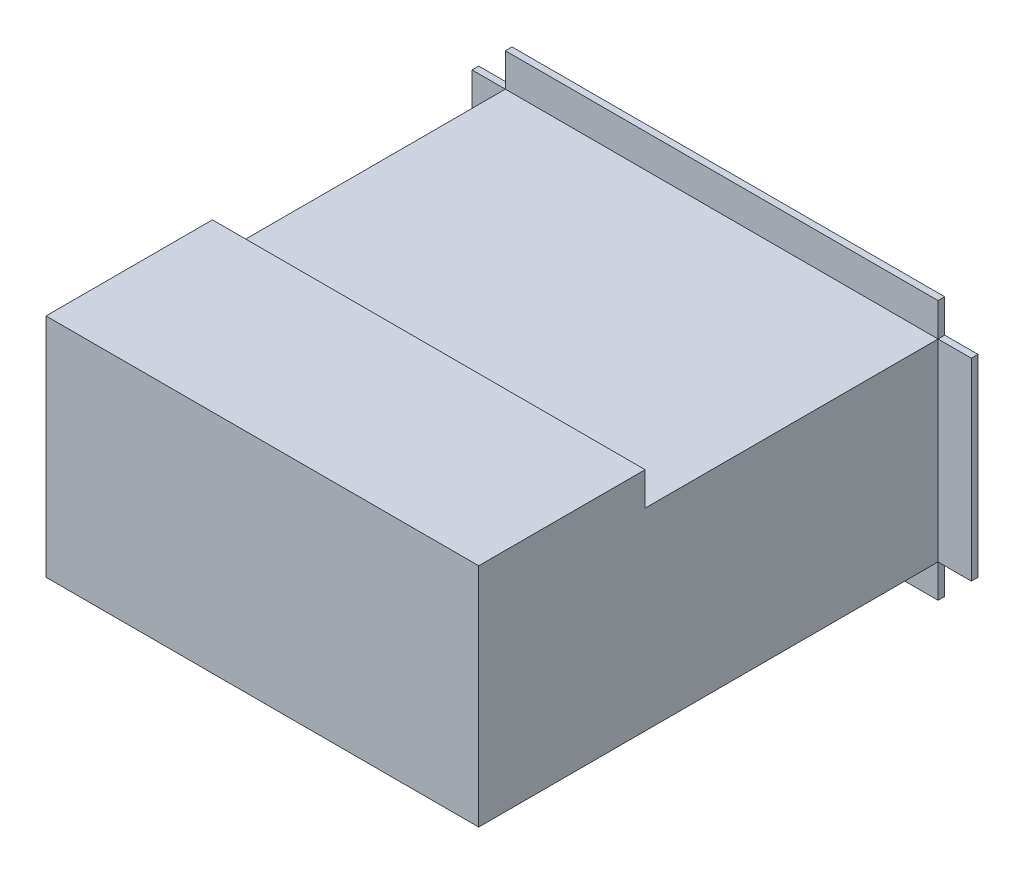
ISO-10303-21;
HEADER;
FILE_DESCRIPTION(('STEP AP214'),'2;1');
FILE_NAME('part.step','',(''),(''),'','','');
FILE_SCHEMA(('AUTOMOTIVE_DESIGN { 1 0 10303 214 1 1 1 1 }'));
ENDSEC;
DATA;
#1=APPLICATION_CONTEXT('core data for automotive mechanical design processes');
#2=APPLICATION_PROTOCOL_DEFINITION('international standard','automotive_design',2000,#1);
#3=PRODUCT_CONTEXT('',#1,'mechanical');
#4=PRODUCT('Part','Part','',(#3));
#5=PRODUCT_RELATED_PRODUCT_CATEGORY('part','',(#4));
#6=PRODUCT_DEFINITION_FORMATION('','',#4);
#7=PRODUCT_DEFINITION_CONTEXT('part definition',#1,'design');
#8=PRODUCT_DEFINITION('design','',#6,#7);
#9=PRODUCT_DEFINITION_SHAPE('','',#8);
#10=(LENGTH_UNIT() NAMED_UNIT(*) SI_UNIT(.MILLI.,.METRE.));
#11=(NAMED_UNIT(*) PLANE_ANGLE_UNIT() SI_UNIT($,.RADIAN.));
#12=(NAMED_UNIT(*) SI_UNIT($,.STERADIAN.) SOLID_ANGLE_UNIT());
#13=UNCERTAINTY_MEASURE_WITH_UNIT(LENGTH_MEASURE(1.E-05),#10,'distance_accuracy_value','');
#14=(GEOMETRIC_REPRESENTATION_CONTEXT(3) GLOBAL_UNCERTAINTY_ASSIGNED_CONTEXT((#13)) GLOBAL_UNIT_ASSIGNED_CONTEXT((#10,
#11,#12)) REPRESENTATION_CONTEXT('',''));
#15=CARTESIAN_POINT('',(0.,0.,0.));
#16=DIRECTION('',(0.,0.,1.));
#17=DIRECTION('',(1.,0.,0.));
#18=AXIS2_PLACEMENT_3D('',#15,#16,#17);
#19=CARTESIAN_POINT('',(-6.5,2.4,9.));
#20=DIRECTION('',(0.,0.,1.));
#21=DIRECTION('',(1.,0.,0.));
#22=AXIS2_PLACEMENT_3D('',#19,#20,#21);
#23=PLANE('',#22);
#24=DIRECTION('',(-1.,0.,0.));
#25=VECTOR('',#24,1.);
#26=CARTESIAN_POINT('',(6.3,-3.2,9.));
#27=LINE('',#26,#25);
#28=CARTESIAN_POINT('',(6.3,-3.2,9.));
#29=VERTEX_POINT('',#28);
#30=CARTESIAN_POINT('',(-6.3,-3.2,9.));
#31=VERTEX_POINT('',#30);
#32=EDGE_CURVE('E256',#29,#31,#27,.T.);
#33=ORIENTED_EDGE('',*,*,#32,.T.);
#34=DIRECTION('',(0.,1.,0.));
#35=VECTOR('',#34,1.);
#36=CARTESIAN_POINT('',(-6.3,-3.2,9.));
#37=LINE('',#36,#35);
#38=CARTESIAN_POINT('',(-6.3,2.2,9.));
#39=VERTEX_POINT('',#38);
#40=EDGE_CURVE('E244',#31,#39,#37,.T.);
#41=ORIENTED_EDGE('',*,*,#40,.T.);
#42=DIRECTION('',(1.,0.,0.));
#43=VECTOR('',#42,1.);
#44=CARTESIAN_POINT('',(-6.3,2.2,9.));
#45=LINE('',#44,#43);
#46=CARTESIAN_POINT('',(6.3,2.2,9.));
#47=VERTEX_POINT('',#46);
#48=EDGE_CURVE('E265',#39,#47,#45,.T.);
#49=ORIENTED_EDGE('',*,*,#48,.T.);
#50=DIRECTION('',(0.,-1.,0.));
#51=VECTOR('',#50,1.);
#52=CARTESIAN_POINT('',(6.3,2.2,9.));
#53=LINE('',#52,#51);
#54=EDGE_CURVE('E261',#47,#29,#53,.T.);
#55=ORIENTED_EDGE('',*,*,#54,.T.);
#56=EDGE_LOOP('',(#33,#41,#49,#55));
#57=FACE_BOUND('',#56,.T.);
#58=DIRECTION('',(1.,0.,0.));
#59=VECTOR('',#58,1.);
#60=CARTESIAN_POINT('',(5.,-0.199999999999997,9.));
#61=LINE('',#60,#59);
#62=CARTESIAN_POINT('',(-5.,-0.199999999999996,9.));
#63=VERTEX_POINT('',#62);
#64=CARTESIAN_POINT('',(5.,-0.199999999999997,9.));
#65=VERTEX_POINT('',#64);
#66=EDGE_CURVE('E236',#63,#65,#61,.T.);
#67=ORIENTED_EDGE('',*,*,#66,.F.);
#68=DIRECTION('',(0.,1.,0.));
#69=VECTOR('',#68,1.);
#70=CARTESIAN_POINT('',(-5.,-0.199999999999996,9.));
#71=LINE('',#70,#69);
#72=CARTESIAN_POINT('',(-5.,-2.19999999999999,9.));
#73=VERTEX_POINT('',#72);
#74=EDGE_CURVE('E223',#73,#63,#71,.T.);
#75=ORIENTED_EDGE('',*,*,#74,.F.);
#76=DIRECTION('',(-1.,0.,0.));
#77=VECTOR('',#76,1.);
#78=CARTESIAN_POINT('',(5.,-2.2,9.));
#79=LINE('',#78,#77);
#80=CARTESIAN_POINT('',(5.,-2.2,9.));
#81=VERTEX_POINT('',#80);
#82=EDGE_CURVE('E209',#81,#73,#79,.T.);
#83=ORIENTED_EDGE('',*,*,#82,.F.);
#84=DIRECTION('',(0.,-1.,0.));
#85=VECTOR('',#84,1.);
#86=CARTESIAN_POINT('',(5.,-0.199999999999997,9.));
#87=LINE('',#86,#85);
#88=EDGE_CURVE('E220',#65,#81,#87,.T.);
#89=ORIENTED_EDGE('',*,*,#88,.F.);
#90=EDGE_LOOP('',(#67,#75,#83,#89));
#91=FACE_BOUND('',#90,.T.);
#92=ADVANCED_FACE('F37',(#57,#91),#23,.F.);
#93=CARTESIAN_POINT('',(-6.5,3.4,14.));
#94=DIRECTION('',(1.,0.,0.));
#95=DIRECTION('',(0.,0.,-1.));
#96=AXIS2_PLACEMENT_3D('',#93,#94,#95);
#97=PLANE('',#96);
#98=DIRECTION('',(0.,1.,0.));
#99=VECTOR('',#98,1.);
#100=CARTESIAN_POINT('',(-6.5,3.4,0.200000000000001));
#101=LINE('',#100,#99);
#102=CARTESIAN_POINT('',(-6.5,-3.4,0.200000000000001));
#103=VERTEX_POINT('',#102);
#104=CARTESIAN_POINT('',(-6.5,2.4,0.200000000000001));
#105=VERTEX_POINT('',#104);
#106=EDGE_CURVE('E346',#103,#105,#101,.T.);
#107=ORIENTED_EDGE('',*,*,#106,.F.);
#108=DIRECTION('',(0.,0.,-1.));
#109=VECTOR('',#108,1.);
#110=CARTESIAN_POINT('',(-6.5,-3.4,14.));
#111=LINE('',#110,#109);
#112=CARTESIAN_POINT('',(-6.5,-3.4,14.));
#113=VERTEX_POINT('',#112);
#114=EDGE_CURVE('E407',#113,#103,#111,.T.);
#115=ORIENTED_EDGE('',*,*,#114,.F.);
#116=DIRECTION('',(0.,-1.,0.));
#117=VECTOR('',#116,1.);
#118=CARTESIAN_POINT('',(-6.5,3.4,14.));
#119=LINE('',#118,#117);
#120=CARTESIAN_POINT('',(-6.5,3.4,14.));
#121=VERTEX_POINT('',#120);
#122=EDGE_CURVE('E387',#121,#113,#119,.T.);
#123=ORIENTED_EDGE('',*,*,#122,.F.);
#124=DIRECTION('',(0.,0.,-1.));
#125=VECTOR('',#124,1.);
#126=CARTESIAN_POINT('',(-6.5,3.4,14.));
#127=LINE('',#126,#125);
#128=CARTESIAN_POINT('',(-6.5,3.4,9.));
#129=VERTEX_POINT('',#128);
#130=EDGE_CURVE('E397',#121,#129,#127,.T.);
#131=ORIENTED_EDGE('',*,*,#130,.T.);
#132=DIRECTION('',(0.,1.,0.));
#133=VECTOR('',#132,1.);
#134=CARTESIAN_POINT('',(-6.5,2.4,9.));
#135=LINE('',#134,#133);
#136=CARTESIAN_POINT('',(-6.5,2.4,9.));
#137=VERTEX_POINT('',#136);
#138=EDGE_CURVE('E370',#137,#129,#135,.T.);
#139=ORIENTED_EDGE('',*,*,#138,.F.);
#140=DIRECTION('',(0.,0.,1.));
#141=VECTOR('',#140,1.);
#142=CARTESIAN_POINT('',(-6.5,2.4,0.200000000000001));
#143=LINE('',#142,#141);
#144=EDGE_CURVE('E358',#105,#137,#143,.T.);
#145=ORIENTED_EDGE('',*,*,#144,.F.);
#146=EDGE_LOOP('',(#107,#115,#123,#131,#139,#145));
#147=FACE_BOUND('',#146,.T.);
#148=ADVANCED_FACE('F459',(#147),#97,.F.);
#149=CARTESIAN_POINT('',(-6.5,-3.4,14.));
#150=DIRECTION('',(0.,1.,0.));
#151=DIRECTION('',(-1.,0.,0.));
#152=AXIS2_PLACEMENT_3D('',#149,#150,#151);
#153=PLANE('',#152);
#154=DIRECTION('',(-1.,0.,0.));
#155=VECTOR('',#154,1.);
#156=CARTESIAN_POINT('',(-6.5,-3.4,0.200000000000001));
#157=LINE('',#156,#155);
#158=CARTESIAN_POINT('',(6.5,-3.4,0.200000000000001));
#159=VERTEX_POINT('',#158);
#160=EDGE_CURVE('E343',#159,#103,#157,.T.);
#161=ORIENTED_EDGE('',*,*,#160,.F.);
#162=DIRECTION('',(0.,0.,-1.));
#163=VECTOR('',#162,1.);
#164=CARTESIAN_POINT('',(6.5,-3.4,14.));
#165=LINE('',#164,#163);
#166=CARTESIAN_POINT('',(6.5,-3.4,14.));
#167=VERTEX_POINT('',#166);
#168=EDGE_CURVE('E404',#167,#159,#165,.T.);
#169=ORIENTED_EDGE('',*,*,#168,.F.);
#170=DIRECTION('',(1.,0.,0.));
#171=VECTOR('',#170,1.);
#172=CARTESIAN_POINT('',(-6.5,-3.4,14.));
#173=LINE('',#172,#171);
#174=EDGE_CURVE('E390',#113,#167,#173,.T.);
#175=ORIENTED_EDGE('',*,*,#174,.F.);
#176=ORIENTED_EDGE('',*,*,#114,.T.);
#177=EDGE_LOOP('',(#161,#169,#175,#176));
#178=FACE_BOUND('',#177,.T.);
#179=ADVANCED_FACE('F465',(#178),#153,.F.);
#180=CARTESIAN_POINT('',(6.5,3.4,14.));
#181=DIRECTION('',(-1.,0.,0.));
#182=DIRECTION('',(0.,-1.,0.));
#183=AXIS2_PLACEMENT_3D('',#180,#181,#182);
#184=PLANE('',#183);
#185=DIRECTION('',(0.,-1.,0.));
#186=VECTOR('',#185,1.);
#187=CARTESIAN_POINT('',(6.5,3.4,0.200000000000001));
#188=LINE('',#187,#186);
#189=CARTESIAN_POINT('',(6.5,2.4,0.199999999999998));
#190=VERTEX_POINT('',#189);
#191=EDGE_CURVE('E327',#190,#159,#188,.T.);
#192=ORIENTED_EDGE('',*,*,#191,.F.);
#193=DIRECTION('',(0.,0.,-1.));
#194=VECTOR('',#193,1.);
#195=CARTESIAN_POINT('',(6.5,2.4,0.199999999999998));
#196=LINE('',#195,#194);
#197=CARTESIAN_POINT('',(6.5,2.4,9.));
#198=VERTEX_POINT('',#197);
#199=EDGE_CURVE('E364',#198,#190,#196,.T.);
#200=ORIENTED_EDGE('',*,*,#199,.F.);
#201=DIRECTION('',(0.,1.,0.));
#202=VECTOR('',#201,1.);
#203=CARTESIAN_POINT('',(6.5,2.4,9.));
#204=LINE('',#203,#202);
#205=CARTESIAN_POINT('',(6.5,3.4,9.));
#206=VERTEX_POINT('',#205);
#207=EDGE_CURVE('E377',#198,#206,#204,.T.);
#208=ORIENTED_EDGE('',*,*,#207,.T.);
#209=DIRECTION('',(0.,0.,-1.));
#210=VECTOR('',#209,1.);
#211=CARTESIAN_POINT('',(6.5,3.4,14.));
#212=LINE('',#211,#210);
#213=CARTESIAN_POINT('',(6.5,3.4,14.));
#214=VERTEX_POINT('',#213);
#215=EDGE_CURVE('E401',#214,#206,#212,.T.);
#216=ORIENTED_EDGE('',*,*,#215,.F.);
#217=DIRECTION('',(0.,1.,0.));
#218=VECTOR('',#217,1.);
#219=CARTESIAN_POINT('',(6.5,3.4,14.));
#220=LINE('',#219,#218);
#221=EDGE_CURVE('E392',#167,#214,#220,.T.);
#222=ORIENTED_EDGE('',*,*,#221,.F.);
#223=ORIENTED_EDGE('',*,*,#168,.T.);
#224=EDGE_LOOP('',(#192,#200,#208,#216,#222,#223));
#225=FACE_BOUND('',#224,.T.);
#226=ADVANCED_FACE('F538',(#225),#184,.F.);
#227=CARTESIAN_POINT('',(-6.5,3.4,14.));
#228=DIRECTION('',(0.,-1.,0.));
#229=DIRECTION('',(1.,0.,0.));
#230=AXIS2_PLACEMENT_3D('',#227,#228,#229);
#231=PLANE('',#230);
#232=CARTESIAN_POINT('',(-6.5,3.4,0.200000000000001));
#233=VERTEX_POINT('',#232);
#234=CARTESIAN_POINT('',(-6.5,3.4,0.));
#235=VERTEX_POINT('',#234);
#236=EDGE_CURVE('E396',#233,#235,#127,.T.);
#237=ORIENTED_EDGE('',*,*,#236,.F.);
#238=DIRECTION('',(-1.,0.,0.));
#239=VECTOR('',#238,1.);
#240=CARTESIAN_POINT('',(-6.5,3.4,0.200000000000001));
#241=LINE('',#240,#239);
#242=CARTESIAN_POINT('',(6.5,3.4,0.199999999999998));
#243=VERTEX_POINT('',#242);
#244=EDGE_CURVE('E356',#243,#233,#241,.T.);
#245=ORIENTED_EDGE('',*,*,#244,.F.);
#246=CARTESIAN_POINT('',(6.5,3.4,0.));
#247=VERTEX_POINT('',#246);
#248=EDGE_CURVE('E400',#243,#247,#212,.T.);
#249=ORIENTED_EDGE('',*,*,#248,.T.);
#250=DIRECTION('',(-1.,0.,0.));
#251=VECTOR('',#250,1.);
#252=CARTESIAN_POINT('',(-6.5,3.4,0.));
#253=LINE('',#252,#251);
#254=EDGE_CURVE('E384',#247,#235,#253,.T.);
#255=ORIENTED_EDGE('',*,*,#254,.T.);
#256=EDGE_LOOP('',(#237,#245,#249,#255));
#257=FACE_BOUND('',#256,.T.);
#258=ADVANCED_FACE('F535',(#257),#231,.F.);
#259=DIRECTION('',(0.,-1.,0.));
#260=VECTOR('',#259,1.);
#261=CARTESIAN_POINT('',(-6.5,3.4,0.));
#262=LINE('',#261,#260);
#263=CARTESIAN_POINT('',(-6.5,2.4,0.));
#264=VERTEX_POINT('',#263);
#265=EDGE_CURVE('E374',#235,#264,#262,.T.);
#266=ORIENTED_EDGE('',*,*,#265,.T.);
#267=DIRECTION('',(0.,0.,1.));
#268=VECTOR('',#267,1.);
#269=CARTESIAN_POINT('',(-6.5,2.4,14.));
#270=LINE('',#269,#268);
#271=EDGE_CURVE('E352',#264,#105,#270,.T.);
#272=ORIENTED_EDGE('',*,*,#271,.T.);
#273=DIRECTION('',(0.,1.,0.));
#274=VECTOR('',#273,1.);
#275=CARTESIAN_POINT('',(-6.5,2.4,0.200000000000001));
#276=LINE('',#275,#274);
#277=EDGE_CURVE('E371',#105,#233,#276,.T.);
#278=ORIENTED_EDGE('',*,*,#277,.T.);
#279=ORIENTED_EDGE('',*,*,#236,.T.);
#280=EDGE_LOOP('',(#266,#272,#278,#279));
#281=FACE_BOUND('',#280,.T.);
#282=ADVANCED_FACE('F39',(#281),#97,.F.);
#283=DIRECTION('',(0.,1.,0.));
#284=VECTOR('',#283,1.);
#285=CARTESIAN_POINT('',(6.5,2.4,0.199999999999998));
#286=LINE('',#285,#284);
#287=EDGE_CURVE('E375',#190,#243,#286,.T.);
#288=ORIENTED_EDGE('',*,*,#287,.F.);
#289=DIRECTION('',(0.,0.,-1.));
#290=VECTOR('',#289,1.);
#291=CARTESIAN_POINT('',(6.5,2.4,14.));
#292=LINE('',#291,#290);
#293=CARTESIAN_POINT('',(6.5,2.4,0.));
#294=VERTEX_POINT('',#293);
#295=EDGE_CURVE('E349',#190,#294,#292,.T.);
#296=ORIENTED_EDGE('',*,*,#295,.T.);
#297=DIRECTION('',(0.,1.,0.));
#298=VECTOR('',#297,1.);
#299=CARTESIAN_POINT('',(6.5,3.4,0.));
#300=LINE('',#299,#298);
#301=EDGE_CURVE('E382',#294,#247,#300,.T.);
#302=ORIENTED_EDGE('',*,*,#301,.T.);
#303=ORIENTED_EDGE('',*,*,#248,.F.);
#304=EDGE_LOOP('',(#288,#296,#302,#303));
#305=FACE_BOUND('',#304,.T.);
#306=ADVANCED_FACE('F533',(#305),#184,.F.);
#307=ORIENTED_EDGE('',*,*,#215,.T.);
#308=DIRECTION('',(1.,0.,0.));
#309=VECTOR('',#308,1.);
#310=CARTESIAN_POINT('',(-6.5,3.4,9.));
#311=LINE('',#310,#309);
#312=EDGE_CURVE('E354',#129,#206,#311,.T.);
#313=ORIENTED_EDGE('',*,*,#312,.F.);
#314=ORIENTED_EDGE('',*,*,#130,.F.);
#315=DIRECTION('',(-1.,0.,0.));
#316=VECTOR('',#315,1.);
#317=CARTESIAN_POINT('',(-6.5,3.4,14.));
#318=LINE('',#317,#316);
#319=EDGE_CURVE('E394',#214,#121,#318,.T.);
#320=ORIENTED_EDGE('',*,*,#319,.F.);
#321=EDGE_LOOP('',(#307,#313,#314,#320));
#322=FACE_BOUND('',#321,.T.);
#323=ADVANCED_FACE('F529',(#322),#231,.F.);
#324=CARTESIAN_POINT('',(-6.5,-3.4,14.));
#325=DIRECTION('',(0.,0.,1.));
#326=DIRECTION('',(1.,0.,0.));
#327=AXIS2_PLACEMENT_3D('',#324,#325,#326);
#328=PLANE('',#327);
#329=ORIENTED_EDGE('',*,*,#122,.T.);
#330=ORIENTED_EDGE('',*,*,#174,.T.);
#331=ORIENTED_EDGE('',*,*,#221,.T.);
#332=ORIENTED_EDGE('',*,*,#319,.T.);
#333=EDGE_LOOP('',(#329,#330,#331,#332));
#334=FACE_BOUND('',#333,.T.);
#335=ADVANCED_FACE('F525',(#334),#328,.T.);
#336=CARTESIAN_POINT('',(-6.5,-3.4,0.));
#337=DIRECTION('',(0.,0.,1.));
#338=DIRECTION('',(1.,0.,0.));
#339=AXIS2_PLACEMENT_3D('',#336,#337,#338);
#340=PLANE('',#339);
#341=DIRECTION('',(1.,0.,0.));
#342=VECTOR('',#341,1.);
#343=CARTESIAN_POINT('',(-6.3,2.2,0.));
#344=LINE('',#343,#342);
#345=CARTESIAN_POINT('',(-6.3,2.2,0.));
#346=VERTEX_POINT('',#345);
#347=CARTESIAN_POINT('',(6.3,2.2,0.));
#348=VERTEX_POINT('',#347);
#349=EDGE_CURVE('E245',#346,#348,#344,.T.);
#350=ORIENTED_EDGE('',*,*,#349,.F.);
#351=DIRECTION('',(0.,1.,0.));
#352=VECTOR('',#351,1.);
#353=CARTESIAN_POINT('',(-6.3,-3.2,0.));
#354=LINE('',#353,#352);
#355=CARTESIAN_POINT('',(-6.3,-3.2,0.));
#356=VERTEX_POINT('',#355);
#357=EDGE_CURVE('E248',#356,#346,#354,.T.);
#358=ORIENTED_EDGE('',*,*,#357,.F.);
#359=DIRECTION('',(-1.,0.,0.));
#360=VECTOR('',#359,1.);
#361=CARTESIAN_POINT('',(6.3,-3.2,0.));
#362=LINE('',#361,#360);
#363=CARTESIAN_POINT('',(6.3,-3.2,0.));
#364=VERTEX_POINT('',#363);
#365=EDGE_CURVE('E213',#364,#356,#362,.T.);
#366=ORIENTED_EDGE('',*,*,#365,.F.);
#367=DIRECTION('',(0.,-1.,0.));
#368=VECTOR('',#367,1.);
#369=CARTESIAN_POINT('',(6.3,2.2,0.));
#370=LINE('',#369,#368);
#371=EDGE_CURVE('E242',#348,#364,#370,.T.);
#372=ORIENTED_EDGE('',*,*,#371,.F.);
#373=EDGE_LOOP('',(#350,#358,#366,#372));
#374=FACE_BOUND('',#373,.T.);
#375=ORIENTED_EDGE('',*,*,#301,.F.);
#376=DIRECTION('',(1.,0.,0.));
#377=VECTOR('',#376,1.);
#378=CARTESIAN_POINT('',(7.5,2.4,0.));
#379=LINE('',#378,#377);
#380=CARTESIAN_POINT('',(7.5,2.4,0.));
#381=VERTEX_POINT('',#380);
#382=EDGE_CURVE('E294',#294,#381,#379,.T.);
#383=ORIENTED_EDGE('',*,*,#382,.T.);
#384=DIRECTION('',(0.,-1.,0.));
#385=VECTOR('',#384,1.);
#386=CARTESIAN_POINT('',(7.5,2.4,0.));
#387=LINE('',#386,#385);
#388=CARTESIAN_POINT('',(7.5,-3.40097619682854,0.));
#389=VERTEX_POINT('',#388);
#390=EDGE_CURVE('E273',#381,#389,#387,.T.);
#391=ORIENTED_EDGE('',*,*,#390,.T.);
#392=DIRECTION('',(-0.999999523520217,0.00097619636340952,0.));
#393=VECTOR('',#392,1.);
#394=CARTESIAN_POINT('',(7.5,-3.40097619682854,0.));
#395=LINE('',#394,#393);
#396=CARTESIAN_POINT('',(6.5,-3.4,0.));
#397=VERTEX_POINT('',#396);
#398=EDGE_CURVE('E276',#389,#397,#395,.T.);
#399=ORIENTED_EDGE('',*,*,#398,.T.);
#400=DIRECTION('',(0.,-1.,0.));
#401=VECTOR('',#400,1.);
#402=CARTESIAN_POINT('',(6.5,-3.4,0.));
#403=LINE('',#402,#401);
#404=CARTESIAN_POINT('',(6.5,-4.4,0.));
#405=VERTEX_POINT('',#404);
#406=EDGE_CURVE('E279',#397,#405,#403,.T.);
#407=ORIENTED_EDGE('',*,*,#406,.T.);
#408=DIRECTION('',(-1.,0.,0.));
#409=VECTOR('',#408,1.);
#410=CARTESIAN_POINT('',(6.5,-4.4,0.));
#411=LINE('',#410,#409);
#412=CARTESIAN_POINT('',(-6.5,-4.4,0.));
#413=VERTEX_POINT('',#412);
#414=EDGE_CURVE('E282',#405,#413,#411,.T.);
#415=ORIENTED_EDGE('',*,*,#414,.T.);
#416=DIRECTION('',(0.,1.,0.));
#417=VECTOR('',#416,1.);
#418=CARTESIAN_POINT('',(-6.5,-4.4,0.));
#419=LINE('',#418,#417);
#420=CARTESIAN_POINT('',(-6.5,-3.4,0.));
#421=VERTEX_POINT('',#420);
#422=EDGE_CURVE('E285',#413,#421,#419,.T.);
#423=ORIENTED_EDGE('',*,*,#422,.T.);
#424=DIRECTION('',(-1.,0.,0.));
#425=VECTOR('',#424,1.);
#426=CARTESIAN_POINT('',(-6.5,-3.4,0.));
#427=LINE('',#426,#425);
#428=CARTESIAN_POINT('',(-7.5,-3.4,0.));
#429=VERTEX_POINT('',#428);
#430=EDGE_CURVE('E288',#421,#429,#427,.T.);
#431=ORIENTED_EDGE('',*,*,#430,.T.);
#432=DIRECTION('',(0.,1.,0.));
#433=VECTOR('',#432,1.);
#434=CARTESIAN_POINT('',(-7.5,-3.4,0.));
#435=LINE('',#434,#433);
#436=CARTESIAN_POINT('',(-7.5,2.4,0.));
#437=VERTEX_POINT('',#436);
#438=EDGE_CURVE('E291',#429,#437,#435,.T.);
#439=ORIENTED_EDGE('',*,*,#438,.T.);
#440=EDGE_CURVE('E295',#437,#264,#379,.T.);
#441=ORIENTED_EDGE('',*,*,#440,.T.);
#442=ORIENTED_EDGE('',*,*,#265,.F.);
#443=ORIENTED_EDGE('',*,*,#254,.F.);
#444=EDGE_LOOP('',(#375,#383,#391,#399,#407,#415,#423,#431,#439,#441,#442,#443));
#445=FACE_BOUND('',#444,.T.);
#446=ADVANCED_FACE('F518',(#374,#445),#340,.F.);
#447=CARTESIAN_POINT('',(-6.5,2.4,0.200000000000001));
#448=DIRECTION('',(0.,0.,-1.));
#449=DIRECTION('',(-1.,0.,0.));
#450=AXIS2_PLACEMENT_3D('',#447,#448,#449);
#451=PLANE('',#450);
#452=ORIENTED_EDGE('',*,*,#244,.T.);
#453=ORIENTED_EDGE('',*,*,#277,.F.);
#454=DIRECTION('',(-1.,0.,0.));
#455=VECTOR('',#454,1.);
#456=CARTESIAN_POINT('',(-6.5,2.4,0.200000000000001));
#457=LINE('',#456,#455);
#458=EDGE_CURVE('E367',#190,#105,#457,.T.);
#459=ORIENTED_EDGE('',*,*,#458,.F.);
#460=ORIENTED_EDGE('',*,*,#287,.T.);
#461=EDGE_LOOP('',(#452,#453,#459,#460));
#462=FACE_BOUND('',#461,.T.);
#463=ADVANCED_FACE('F515',(#462),#451,.F.);
#464=CARTESIAN_POINT('',(-6.5,2.4,9.));
#465=DIRECTION('',(0.,0.,1.));
#466=DIRECTION('',(1.,0.,0.));
#467=AXIS2_PLACEMENT_3D('',#464,#465,#466);
#468=PLANE('',#467);
#469=ORIENTED_EDGE('',*,*,#312,.T.);
#470=ORIENTED_EDGE('',*,*,#207,.F.);
#471=DIRECTION('',(1.,0.,0.));
#472=VECTOR('',#471,1.);
#473=CARTESIAN_POINT('',(-6.5,2.4,9.));
#474=LINE('',#473,#472);
#475=EDGE_CURVE('E361',#137,#198,#474,.T.);
#476=ORIENTED_EDGE('',*,*,#475,.F.);
#477=ORIENTED_EDGE('',*,*,#138,.T.);
#478=EDGE_LOOP('',(#469,#470,#476,#477));
#479=FACE_BOUND('',#478,.T.);
#480=ADVANCED_FACE('F513',(#479),#468,.F.);
#481=CARTESIAN_POINT('',(-6.5,2.4,9.));
#482=DIRECTION('',(0.,1.,0.));
#483=DIRECTION('',(-1.,0.,0.));
#484=AXIS2_PLACEMENT_3D('',#481,#482,#483);
#485=PLANE('',#484);
#486=ORIENTED_EDGE('',*,*,#144,.T.);
#487=ORIENTED_EDGE('',*,*,#475,.T.);
#488=ORIENTED_EDGE('',*,*,#199,.T.);
#489=ORIENTED_EDGE('',*,*,#458,.T.);
#490=EDGE_LOOP('',(#486,#487,#488,#489));
#491=FACE_BOUND('',#490,.T.);
#492=ADVANCED_FACE('F481',(#491),#485,.T.);
#493=CARTESIAN_POINT('',(7.5,2.4,0.2));
#494=DIRECTION('',(0.,1.,0.));
#495=DIRECTION('',(0.,0.,1.));
#496=AXIS2_PLACEMENT_3D('',#493,#494,#495);
#497=PLANE('',#496);
#498=ORIENTED_EDGE('',*,*,#271,.F.);
#499=ORIENTED_EDGE('',*,*,#440,.F.);
#500=DIRECTION('',(0.,0.,-1.));
#501=VECTOR('',#500,1.);
#502=CARTESIAN_POINT('',(-7.5,2.4,0.2));
#503=LINE('',#502,#501);
#504=CARTESIAN_POINT('',(-7.5,2.4,0.2));
#505=VERTEX_POINT('',#504);
#506=EDGE_CURVE('E328',#505,#437,#503,.T.);
#507=ORIENTED_EDGE('',*,*,#506,.F.);
#508=DIRECTION('',(1.,0.,0.));
#509=VECTOR('',#508,1.);
#510=CARTESIAN_POINT('',(7.5,2.4,0.2));
#511=LINE('',#510,#509);
#512=EDGE_CURVE('E320',#505,#105,#511,.T.);
#513=ORIENTED_EDGE('',*,*,#512,.T.);
#514=EDGE_LOOP('',(#498,#499,#507,#513));
#515=FACE_BOUND('',#514,.T.);
#516=ADVANCED_FACE('F478',(#515),#497,.T.);
#517=ORIENTED_EDGE('',*,*,#295,.F.);
#518=CARTESIAN_POINT('',(7.5,2.4,0.2));
#519=VERTEX_POINT('',#518);
#520=EDGE_CURVE('E319',#190,#519,#511,.T.);
#521=ORIENTED_EDGE('',*,*,#520,.T.);
#522=DIRECTION('',(0.,0.,-1.));
#523=VECTOR('',#522,1.);
#524=CARTESIAN_POINT('',(7.5,2.4,0.2));
#525=LINE('',#524,#523);
#526=EDGE_CURVE('E324',#519,#381,#525,.T.);
#527=ORIENTED_EDGE('',*,*,#526,.T.);
#528=ORIENTED_EDGE('',*,*,#382,.F.);
#529=EDGE_LOOP('',(#517,#521,#527,#528));
#530=FACE_BOUND('',#529,.T.);
#531=ADVANCED_FACE('F475',(#530),#497,.T.);
#532=CARTESIAN_POINT('',(7.5,2.4,0.2));
#533=DIRECTION('',(0.,0.,-1.));
#534=DIRECTION('',(-1.,0.,0.));
#535=AXIS2_PLACEMENT_3D('',#532,#533,#534);
#536=PLANE('',#535);
#537=DIRECTION('',(-1.,0.,0.));
#538=VECTOR('',#537,1.);
#539=CARTESIAN_POINT('',(-6.5,-3.4,0.2));
#540=LINE('',#539,#538);
#541=CARTESIAN_POINT('',(-7.5,-3.4,0.2));
#542=VERTEX_POINT('',#541);
#543=EDGE_CURVE('E313',#103,#542,#540,.T.);
#544=ORIENTED_EDGE('',*,*,#543,.F.);
#545=ORIENTED_EDGE('',*,*,#106,.T.);
#546=ORIENTED_EDGE('',*,*,#512,.F.);
#547=DIRECTION('',(0.,1.,0.));
#548=VECTOR('',#547,1.);
#549=CARTESIAN_POINT('',(-7.5,-3.4,0.2));
#550=LINE('',#549,#548);
#551=EDGE_CURVE('E316',#542,#505,#550,.T.);
#552=ORIENTED_EDGE('',*,*,#551,.F.);
#553=EDGE_LOOP('',(#544,#545,#546,#552));
#554=FACE_BOUND('',#553,.T.);
#555=ADVANCED_FACE('F471',(#554),#536,.F.);
#556=DIRECTION('',(0.,-1.,0.));
#557=VECTOR('',#556,1.);
#558=CARTESIAN_POINT('',(6.5,-3.4,0.2));
#559=LINE('',#558,#557);
#560=CARTESIAN_POINT('',(6.5,-4.4,0.2));
#561=VERTEX_POINT('',#560);
#562=EDGE_CURVE('E304',#159,#561,#559,.T.);
#563=ORIENTED_EDGE('',*,*,#562,.F.);
#564=ORIENTED_EDGE('',*,*,#160,.T.);
#565=DIRECTION('',(0.,1.,0.));
#566=VECTOR('',#565,1.);
#567=CARTESIAN_POINT('',(-6.5,-4.4,0.2));
#568=LINE('',#567,#566);
#569=CARTESIAN_POINT('',(-6.5,-4.4,0.2));
#570=VERTEX_POINT('',#569);
#571=EDGE_CURVE('E310',#570,#103,#568,.T.);
#572=ORIENTED_EDGE('',*,*,#571,.F.);
#573=DIRECTION('',(-1.,0.,0.));
#574=VECTOR('',#573,1.);
#575=CARTESIAN_POINT('',(6.5,-4.4,0.2));
#576=LINE('',#575,#574);
#577=EDGE_CURVE('E307',#561,#570,#576,.T.);
#578=ORIENTED_EDGE('',*,*,#577,.F.);
#579=EDGE_LOOP('',(#563,#564,#572,#578));
#580=FACE_BOUND('',#579,.T.);
#581=ADVANCED_FACE('F474',(#580),#536,.F.);
#582=ORIENTED_EDGE('',*,*,#520,.F.);
#583=ORIENTED_EDGE('',*,*,#191,.T.);
#584=DIRECTION('',(-0.999999523520217,0.00097619636340952,0.));
#585=VECTOR('',#584,1.);
#586=CARTESIAN_POINT('',(7.5,-3.40097619682854,0.2));
#587=LINE('',#586,#585);
#588=CARTESIAN_POINT('',(7.5,-3.40097619682854,0.2));
#589=VERTEX_POINT('',#588);
#590=EDGE_CURVE('E301',#589,#159,#587,.T.);
#591=ORIENTED_EDGE('',*,*,#590,.F.);
#592=DIRECTION('',(0.,-1.,0.));
#593=VECTOR('',#592,1.);
#594=CARTESIAN_POINT('',(7.5,2.4,0.2));
#595=LINE('',#594,#593);
#596=EDGE_CURVE('E298',#519,#589,#595,.T.);
#597=ORIENTED_EDGE('',*,*,#596,.F.);
#598=EDGE_LOOP('',(#582,#583,#591,#597));
#599=FACE_BOUND('',#598,.T.);
#600=ADVANCED_FACE('F477',(#599),#536,.F.);
#601=CARTESIAN_POINT('',(7.5,2.4,0.2));
#602=DIRECTION('',(1.,0.,0.));
#603=DIRECTION('',(0.,1.,0.));
#604=AXIS2_PLACEMENT_3D('',#601,#602,#603);
#605=PLANE('',#604);
#606=ORIENTED_EDGE('',*,*,#390,.F.);
#607=ORIENTED_EDGE('',*,*,#526,.F.);
#608=ORIENTED_EDGE('',*,*,#596,.T.);
#609=DIRECTION('',(0.,0.,-1.));
#610=VECTOR('',#609,1.);
#611=CARTESIAN_POINT('',(7.5,-3.40097619682854,0.2));
#612=LINE('',#611,#610);
#613=EDGE_CURVE('E323',#589,#389,#612,.T.);
#614=ORIENTED_EDGE('',*,*,#613,.T.);
#615=EDGE_LOOP('',(#606,#607,#608,#614));
#616=FACE_BOUND('',#615,.T.);
#617=ADVANCED_FACE('F487',(#616),#605,.T.);
#618=CARTESIAN_POINT('',(-7.5,-3.4,0.2));
#619=DIRECTION('',(-1.,0.,0.));
#620=DIRECTION('',(0.,0.,1.));
#621=AXIS2_PLACEMENT_3D('',#618,#619,#620);
#622=PLANE('',#621);
#623=ORIENTED_EDGE('',*,*,#438,.F.);
#624=DIRECTION('',(0.,0.,-1.));
#625=VECTOR('',#624,1.);
#626=CARTESIAN_POINT('',(-7.5,-3.4,0.2));
#627=LINE('',#626,#625);
#628=EDGE_CURVE('E330',#542,#429,#627,.T.);
#629=ORIENTED_EDGE('',*,*,#628,.F.);
#630=ORIENTED_EDGE('',*,*,#551,.T.);
#631=ORIENTED_EDGE('',*,*,#506,.T.);
#632=EDGE_LOOP('',(#623,#629,#630,#631));
#633=FACE_BOUND('',#632,.T.);
#634=ADVANCED_FACE('F483',(#633),#622,.T.);
#635=CARTESIAN_POINT('',(-6.5,-3.4,0.2));
#636=DIRECTION('',(0.,-1.,0.));
#637=DIRECTION('',(0.,0.,-1.));
#638=AXIS2_PLACEMENT_3D('',#635,#636,#637);
#639=PLANE('',#638);
#640=ORIENTED_EDGE('',*,*,#430,.F.);
#641=DIRECTION('',(0.,0.,-1.));
#642=VECTOR('',#641,1.);
#643=CARTESIAN_POINT('',(-6.5,-3.4,0.2));
#644=LINE('',#643,#642);
#645=EDGE_CURVE('E332',#103,#421,#644,.T.);
#646=ORIENTED_EDGE('',*,*,#645,.F.);
#647=ORIENTED_EDGE('',*,*,#543,.T.);
#648=ORIENTED_EDGE('',*,*,#628,.T.);
#649=EDGE_LOOP('',(#640,#646,#647,#648));
#650=FACE_BOUND('',#649,.T.);
#651=ADVANCED_FACE('F486',(#650),#639,.T.);
#652=CARTESIAN_POINT('',(-6.5,-4.4,0.2));
#653=DIRECTION('',(-1.,0.,0.));
#654=DIRECTION('',(0.,0.,1.));
#655=AXIS2_PLACEMENT_3D('',#652,#653,#654);
#656=PLANE('',#655);
#657=ORIENTED_EDGE('',*,*,#422,.F.);
#658=DIRECTION('',(0.,0.,-1.));
#659=VECTOR('',#658,1.);
#660=CARTESIAN_POINT('',(-6.5,-4.4,0.2));
#661=LINE('',#660,#659);
#662=EDGE_CURVE('E334',#570,#413,#661,.T.);
#663=ORIENTED_EDGE('',*,*,#662,.F.);
#664=ORIENTED_EDGE('',*,*,#571,.T.);
#665=ORIENTED_EDGE('',*,*,#645,.T.);
#666=EDGE_LOOP('',(#657,#663,#664,#665));
#667=FACE_BOUND('',#666,.T.);
#668=ADVANCED_FACE('F491',(#667),#656,.T.);
#669=CARTESIAN_POINT('',(6.5,-4.4,0.2));
#670=DIRECTION('',(0.,-1.,0.));
#671=DIRECTION('',(0.,0.,-1.));
#672=AXIS2_PLACEMENT_3D('',#669,#670,#671);
#673=PLANE('',#672);
#674=ORIENTED_EDGE('',*,*,#414,.F.);
#675=DIRECTION('',(0.,0.,-1.));
#676=VECTOR('',#675,1.);
#677=CARTESIAN_POINT('',(6.5,-4.4,0.2));
#678=LINE('',#677,#676);
#679=EDGE_CURVE('E336',#561,#405,#678,.T.);
#680=ORIENTED_EDGE('',*,*,#679,.F.);
#681=ORIENTED_EDGE('',*,*,#577,.T.);
#682=ORIENTED_EDGE('',*,*,#662,.T.);
#683=EDGE_LOOP('',(#674,#680,#681,#682));
#684=FACE_BOUND('',#683,.T.);
#685=ADVANCED_FACE('F495',(#684),#673,.T.);
#686=CARTESIAN_POINT('',(6.5,-3.4,0.2));
#687=DIRECTION('',(1.,0.,0.));
#688=DIRECTION('',(0.,0.,-1.));
#689=AXIS2_PLACEMENT_3D('',#686,#687,#688);
#690=PLANE('',#689);
#691=ORIENTED_EDGE('',*,*,#406,.F.);
#692=DIRECTION('',(0.,0.,-1.));
#693=VECTOR('',#692,1.);
#694=CARTESIAN_POINT('',(6.5,-3.4,0.2));
#695=LINE('',#694,#693);
#696=EDGE_CURVE('E338',#159,#397,#695,.T.);
#697=ORIENTED_EDGE('',*,*,#696,.F.);
#698=ORIENTED_EDGE('',*,*,#562,.T.);
#699=ORIENTED_EDGE('',*,*,#679,.T.);
#700=EDGE_LOOP('',(#691,#697,#698,#699));
#701=FACE_BOUND('',#700,.T.);
#702=ADVANCED_FACE('F499',(#701),#690,.T.);
#703=CARTESIAN_POINT('',(7.5,-3.40097619682854,0.2));
#704=DIRECTION('',(-0.00097619636340952,-0.999999523520217,0.));
#705=DIRECTION('',(0.999999523520216,-0.00097619636340952,0.));
#706=AXIS2_PLACEMENT_3D('',#703,#704,#705);
#707=PLANE('',#706);
#708=ORIENTED_EDGE('',*,*,#398,.F.);
#709=ORIENTED_EDGE('',*,*,#613,.F.);
#710=ORIENTED_EDGE('',*,*,#590,.T.);
#711=ORIENTED_EDGE('',*,*,#696,.T.);
#712=EDGE_LOOP('',(#708,#709,#710,#711));
#713=FACE_BOUND('',#712,.T.);
#714=ADVANCED_FACE('F503',(#713),#707,.T.);
#715=CARTESIAN_POINT('',(-6.3,-3.2,22.708391590555));
#716=DIRECTION('',(-1.,0.,0.));
#717=DIRECTION('',(0.,0.,1.));
#718=AXIS2_PLACEMENT_3D('',#715,#716,#717);
#719=PLANE('',#718);
#720=DIRECTION('',(0.,0.,-1.));
#721=VECTOR('',#720,1.);
#722=CARTESIAN_POINT('',(-6.3,-3.2,22.708391590555));
#723=LINE('',#722,#721);
#724=EDGE_CURVE('E259',#31,#356,#723,.T.);
#725=ORIENTED_EDGE('',*,*,#724,.T.);
#726=ORIENTED_EDGE('',*,*,#357,.T.);
#727=DIRECTION('',(0.,0.,-1.));
#728=VECTOR('',#727,1.);
#729=CARTESIAN_POINT('',(-6.3,2.2,22.708391590555));
#730=LINE('',#729,#728);
#731=EDGE_CURVE('E255',#39,#346,#730,.T.);
#732=ORIENTED_EDGE('',*,*,#731,.F.);
#733=ORIENTED_EDGE('',*,*,#40,.F.);
#734=EDGE_LOOP('',(#725,#726,#732,#733));
#735=FACE_BOUND('',#734,.T.);
#736=ADVANCED_FACE('F469',(#735),#719,.F.);
#737=CARTESIAN_POINT('',(-6.3,2.2,22.708391590555));
#738=DIRECTION('',(0.,1.,0.));
#739=DIRECTION('',(-1.,0.,0.));
#740=AXIS2_PLACEMENT_3D('',#737,#738,#739);
#741=PLANE('',#740);
#742=ORIENTED_EDGE('',*,*,#731,.T.);
#743=ORIENTED_EDGE('',*,*,#349,.T.);
#744=DIRECTION('',(0.,0.,-1.));
#745=VECTOR('',#744,1.);
#746=CARTESIAN_POINT('',(6.3,2.2,22.708391590555));
#747=LINE('',#746,#745);
#748=EDGE_CURVE('E264',#47,#348,#747,.T.);
#749=ORIENTED_EDGE('',*,*,#748,.F.);
#750=ORIENTED_EDGE('',*,*,#48,.F.);
#751=EDGE_LOOP('',(#742,#743,#749,#750));
#752=FACE_BOUND('',#751,.T.);
#753=ADVANCED_FACE('F725',(#752),#741,.F.);
#754=CARTESIAN_POINT('',(6.3,2.2,22.708391590555));
#755=DIRECTION('',(1.,0.,0.));
#756=DIRECTION('',(0.,1.,0.));
#757=AXIS2_PLACEMENT_3D('',#754,#755,#756);
#758=PLANE('',#757);
#759=ORIENTED_EDGE('',*,*,#748,.T.);
#760=ORIENTED_EDGE('',*,*,#371,.T.);
#761=DIRECTION('',(0.,0.,-1.));
#762=VECTOR('',#761,1.);
#763=CARTESIAN_POINT('',(6.3,-3.2,22.708391590555));
#764=LINE('',#763,#762);
#765=EDGE_CURVE('E260',#29,#364,#764,.T.);
#766=ORIENTED_EDGE('',*,*,#765,.F.);
#767=ORIENTED_EDGE('',*,*,#54,.F.);
#768=EDGE_LOOP('',(#759,#760,#766,#767));
#769=FACE_BOUND('',#768,.T.);
#770=ADVANCED_FACE('F734',(#769),#758,.F.);
#771=CARTESIAN_POINT('',(6.3,-3.2,22.708391590555));
#772=DIRECTION('',(0.,-1.,0.));
#773=DIRECTION('',(1.,0.,0.));
#774=AXIS2_PLACEMENT_3D('',#771,#772,#773);
#775=PLANE('',#774);
#776=ORIENTED_EDGE('',*,*,#765,.T.);
#777=ORIENTED_EDGE('',*,*,#365,.T.);
#778=ORIENTED_EDGE('',*,*,#724,.F.);
#779=ORIENTED_EDGE('',*,*,#32,.F.);
#780=EDGE_LOOP('',(#776,#777,#778,#779));
#781=FACE_BOUND('',#780,.T.);
#782=ADVANCED_FACE('F743',(#781),#775,.F.);
#783=CARTESIAN_POINT('',(5.,-0.199999999999997,-10.1980390271856));
#784=DIRECTION('',(0.,-1.,0.));
#785=DIRECTION('',(1.,0.,0.));
#786=AXIS2_PLACEMENT_3D('',#783,#784,#785);
#787=PLANE('',#786);
#788=DIRECTION('',(0.,0.,1.));
#789=VECTOR('',#788,1.);
#790=CARTESIAN_POINT('',(5.,-0.199999999999997,-10.1980390271856));
#791=LINE('',#790,#789);
#792=CARTESIAN_POINT('',(5.,-0.199999999999997,1.));
#793=VERTEX_POINT('',#792);
#794=EDGE_CURVE('E227',#793,#65,#791,.T.);
#795=ORIENTED_EDGE('',*,*,#794,.F.);
#796=DIRECTION('',(-1.,0.,0.));
#797=VECTOR('',#796,1.);
#798=CARTESIAN_POINT('',(5.,-0.199999999999997,1.));
#799=LINE('',#798,#797);
#800=CARTESIAN_POINT('',(-5.,-0.199999999999996,1.));
#801=VERTEX_POINT('',#800);
#802=EDGE_CURVE('E410',#793,#801,#799,.T.);
#803=ORIENTED_EDGE('',*,*,#802,.T.);
#804=DIRECTION('',(0.,0.,1.));
#805=VECTOR('',#804,1.);
#806=CARTESIAN_POINT('',(-5.,-0.199999999999996,-10.1980390271856));
#807=LINE('',#806,#805);
#808=EDGE_CURVE('E239',#801,#63,#807,.T.);
#809=ORIENTED_EDGE('',*,*,#808,.T.);
#810=ORIENTED_EDGE('',*,*,#66,.T.);
#811=EDGE_LOOP('',(#795,#803,#809,#810));
#812=FACE_BOUND('',#811,.T.);
#813=ADVANCED_FACE('F427',(#812),#787,.F.);
#814=CARTESIAN_POINT('',(-5.,-0.199999999999996,-10.1980390271856));
#815=DIRECTION('',(1.,0.,0.));
#816=DIRECTION('',(0.,0.,-1.));
#817=AXIS2_PLACEMENT_3D('',#814,#815,#816);
#818=PLANE('',#817);
#819=ORIENTED_EDGE('',*,*,#808,.F.);
#820=DIRECTION('',(0.,-1.,0.));
#821=VECTOR('',#820,1.);
#822=CARTESIAN_POINT('',(-5.,-0.199999999999996,1.));
#823=LINE('',#822,#821);
#824=CARTESIAN_POINT('',(-5.,-2.2,1.));
#825=VERTEX_POINT('',#824);
#826=EDGE_CURVE('E12',#801,#825,#823,.T.);
#827=ORIENTED_EDGE('',*,*,#826,.T.);
#828=DIRECTION('',(0.,0.,1.));
#829=VECTOR('',#828,1.);
#830=CARTESIAN_POINT('',(-5.,-2.2,-10.1980390271856));
#831=LINE('',#830,#829);
#832=EDGE_CURVE('E214',#825,#73,#831,.T.);
#833=ORIENTED_EDGE('',*,*,#832,.T.);
#834=ORIENTED_EDGE('',*,*,#74,.T.);
#835=EDGE_LOOP('',(#819,#827,#833,#834));
#836=FACE_BOUND('',#835,.T.);
#837=ADVANCED_FACE('F766',(#836),#818,.F.);
#838=CARTESIAN_POINT('',(5.,-2.2,-10.1980390271856));
#839=DIRECTION('',(0.,1.,0.));
#840=DIRECTION('',(-1.,0.,0.));
#841=AXIS2_PLACEMENT_3D('',#838,#839,#840);
#842=PLANE('',#841);
#843=ORIENTED_EDGE('',*,*,#832,.F.);
#844=DIRECTION('',(1.,0.,0.));
#845=VECTOR('',#844,1.);
#846=CARTESIAN_POINT('',(5.,-2.2,1.));
#847=LINE('',#846,#845);
#848=CARTESIAN_POINT('',(5.,-2.2,1.));
#849=VERTEX_POINT('',#848);
#850=EDGE_CURVE('E45',#825,#849,#847,.T.);
#851=ORIENTED_EDGE('',*,*,#850,.T.);
#852=DIRECTION('',(0.,0.,1.));
#853=VECTOR('',#852,1.);
#854=CARTESIAN_POINT('',(5.,-2.2,-10.1980390271856));
#855=LINE('',#854,#853);
#856=EDGE_CURVE('E206',#849,#81,#855,.T.);
#857=ORIENTED_EDGE('',*,*,#856,.T.);
#858=ORIENTED_EDGE('',*,*,#82,.T.);
#859=EDGE_LOOP('',(#843,#851,#857,#858));
#860=FACE_BOUND('',#859,.T.);
#861=ADVANCED_FACE('F208',(#860),#842,.F.);
#862=CARTESIAN_POINT('',(5.,-0.199999999999997,-10.1980390271856));
#863=DIRECTION('',(-1.,0.,0.));
#864=DIRECTION('',(0.,0.,1.));
#865=AXIS2_PLACEMENT_3D('',#862,#863,#864);
#866=PLANE('',#865);
#867=ORIENTED_EDGE('',*,*,#856,.F.);
#868=DIRECTION('',(0.,1.,0.));
#869=VECTOR('',#868,1.);
#870=CARTESIAN_POINT('',(5.,-0.199999999999997,1.));
#871=LINE('',#870,#869);
#872=EDGE_CURVE('E422',#849,#793,#871,.T.);
#873=ORIENTED_EDGE('',*,*,#872,.T.);
#874=ORIENTED_EDGE('',*,*,#794,.T.);
#875=ORIENTED_EDGE('',*,*,#88,.T.);
#876=EDGE_LOOP('',(#867,#873,#874,#875));
#877=FACE_BOUND('',#876,.T.);
#878=ADVANCED_FACE('F225',(#877),#866,.F.);
#879=CARTESIAN_POINT('',(-6.5,-3.4,0.5));
#880=DIRECTION('',(0.,0.,1.));
#881=DIRECTION('',(1.,0.,0.));
#882=AXIS2_PLACEMENT_3D('',#879,#880,#881);
#883=PLANE('',#882);
#884=DIRECTION('',(0.,1.,0.));
#885=VECTOR('',#884,1.);
#886=CARTESIAN_POINT('',(-4.5,-3.4,0.5));
#887=LINE('',#886,#885);
#888=CARTESIAN_POINT('',(-4.5,-1.7,0.5));
#889=VERTEX_POINT('',#888);
#890=CARTESIAN_POINT('',(-4.5,-0.699999999999996,0.5));
#891=VERTEX_POINT('',#890);
#892=EDGE_CURVE('E413',#889,#891,#887,.T.);
#893=ORIENTED_EDGE('',*,*,#892,.T.);
#894=DIRECTION('',(1.,0.,0.));
#895=VECTOR('',#894,1.);
#896=CARTESIAN_POINT('',(-6.5,-0.699999999999996,0.5));
#897=LINE('',#896,#895);
#898=CARTESIAN_POINT('',(4.5,-0.699999999999998,0.5));
#899=VERTEX_POINT('',#898);
#900=EDGE_CURVE('E419',#891,#899,#897,.T.);
#901=ORIENTED_EDGE('',*,*,#900,.T.);
#902=DIRECTION('',(0.,-1.,0.));
#903=VECTOR('',#902,1.);
#904=CARTESIAN_POINT('',(4.5,-3.4,0.5));
#905=LINE('',#904,#903);
#906=CARTESIAN_POINT('',(4.5,-1.7,0.5));
#907=VERTEX_POINT('',#906);
#908=EDGE_CURVE('E417',#899,#907,#905,.T.);
#909=ORIENTED_EDGE('',*,*,#908,.T.);
#910=DIRECTION('',(-1.,0.,0.));
#911=VECTOR('',#910,1.);
#912=CARTESIAN_POINT('',(-6.5,-1.7,0.5));
#913=LINE('',#912,#911);
#914=EDGE_CURVE('E415',#907,#889,#913,.T.);
#915=ORIENTED_EDGE('',*,*,#914,.T.);
#916=EDGE_LOOP('',(#893,#901,#909,#915));
#917=FACE_BOUND('',#916,.T.);
#918=ADVANCED_FACE('F448',(#917),#883,.F.);
#919=CARTESIAN_POINT('',(5.,-2.2,1.));
#920=DIRECTION('',(0.,0.707106781186548,0.707106781186547));
#921=DIRECTION('',(0.,-0.707106781186547,0.707106781186548));
#922=AXIS2_PLACEMENT_3D('',#919,#920,#921);
#923=PLANE('',#922);
#924=DIRECTION('',(-0.577350269189626,-0.577350269189626,0.577350269189626));
#925=VECTOR('',#924,1.);
#926=CARTESIAN_POINT('',(-4.33333333333333,-1.53333333333333,0.333333333333334));
#927=LINE('',#926,#925);
#928=EDGE_CURVE('E231',#889,#825,#927,.T.);
#929=ORIENTED_EDGE('',*,*,#928,.F.);
#930=ORIENTED_EDGE('',*,*,#914,.F.);
#931=DIRECTION('',(0.577350269189626,-0.577350269189625,0.577350269189626));
#932=VECTOR('',#931,1.);
#933=CARTESIAN_POINT('',(5.,-2.2,1.));
#934=LINE('',#933,#932);
#935=EDGE_CURVE('E228',#849,#907,#934,.F.);
#936=ORIENTED_EDGE('',*,*,#935,.F.);
#937=ORIENTED_EDGE('',*,*,#850,.F.);
#938=EDGE_LOOP('',(#929,#930,#936,#937));
#939=FACE_BOUND('',#938,.T.);
#940=ADVANCED_FACE('F446',(#939),#923,.F.);
#941=CARTESIAN_POINT('',(5.,-0.199999999999997,1.));
#942=DIRECTION('',(-0.707106781186547,0.,0.707106781186548));
#943=DIRECTION('',(0.707106781186548,0.,0.707106781186547));
#944=AXIS2_PLACEMENT_3D('',#941,#942,#943);
#945=PLANE('',#944);
#946=ORIENTED_EDGE('',*,*,#935,.T.);
#947=ORIENTED_EDGE('',*,*,#908,.F.);
#948=DIRECTION('',(0.577350269189626,0.577350269189625,0.577350269189626));
#949=VECTOR('',#948,1.);
#950=CARTESIAN_POINT('',(5.,-0.199999999999997,1.));
#951=LINE('',#950,#949);
#952=EDGE_CURVE('E430',#793,#899,#951,.F.);
#953=ORIENTED_EDGE('',*,*,#952,.F.);
#954=ORIENTED_EDGE('',*,*,#872,.F.);
#955=EDGE_LOOP('',(#946,#947,#953,#954));
#956=FACE_BOUND('',#955,.T.);
#957=ADVANCED_FACE('F431',(#956),#945,.F.);
#958=CARTESIAN_POINT('',(-5.,-0.199999999999996,1.));
#959=DIRECTION('',(0.707106781186548,0.,0.707106781186547));
#960=DIRECTION('',(0.707106781186547,0.,-0.707106781186548));
#961=AXIS2_PLACEMENT_3D('',#958,#959,#960);
#962=PLANE('',#961);
#963=ORIENTED_EDGE('',*,*,#928,.T.);
#964=ORIENTED_EDGE('',*,*,#826,.F.);
#965=DIRECTION('',(0.577350269189625,-0.577350269189626,-0.577350269189626));
#966=VECTOR('',#965,1.);
#967=CARTESIAN_POINT('',(-5.,-0.199999999999996,1.));
#968=LINE('',#967,#966);
#969=EDGE_CURVE('E434',#891,#801,#968,.F.);
#970=ORIENTED_EDGE('',*,*,#969,.F.);
#971=ORIENTED_EDGE('',*,*,#892,.F.);
#972=EDGE_LOOP('',(#963,#964,#970,#971));
#973=FACE_BOUND('',#972,.T.);
#974=ADVANCED_FACE('F442',(#973),#962,.F.);
#975=CARTESIAN_POINT('',(5.,-0.199999999999997,1.));
#976=DIRECTION('',(0.,-0.707106781186548,0.707106781186547));
#977=DIRECTION('',(0.,-0.707106781186547,-0.707106781186548));
#978=AXIS2_PLACEMENT_3D('',#975,#976,#977);
#979=PLANE('',#978);
#980=ORIENTED_EDGE('',*,*,#952,.T.);
#981=ORIENTED_EDGE('',*,*,#900,.F.);
#982=ORIENTED_EDGE('',*,*,#969,.T.);
#983=ORIENTED_EDGE('',*,*,#802,.F.);
#984=EDGE_LOOP('',(#980,#981,#982,#983));
#985=FACE_BOUND('',#984,.T.);
#986=ADVANCED_FACE('F436',(#985),#979,.F.);
#987=CLOSED_SHELL('',(#92,#148,#179,#226,#258,#282,#306,#323,#335,#446,#463,#480,#492,#516,#531,
#555,#581,#600,#617,#634,#651,#668,#685,#702,#714,#736,#753,#770,#782,#813,#837,#861,#878,#918,
#940,#957,#974,#986));
#988=MANIFOLD_SOLID_BREP('B2',#987);
#989=ADVANCED_BREP_SHAPE_REPRESENTATION('',(#18,#988),#14);
#990=SHAPE_DEFINITION_REPRESENTATION(#9,#989);
ENDSEC;
END-ISO-10303-21;
